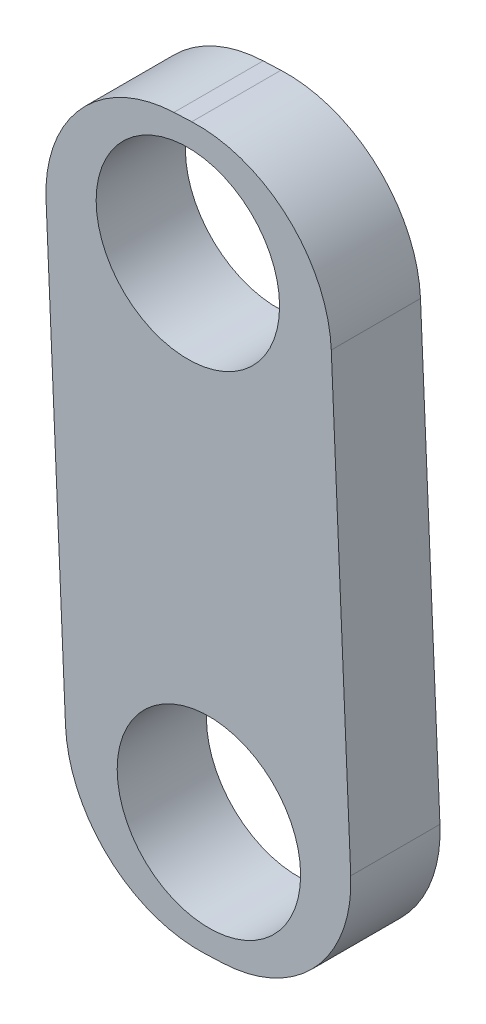
ISO-10303-21;
HEADER;
FILE_DESCRIPTION(('STEP AP214'),'2;1');
FILE_NAME('part.step','',(''),(''),'','','');
FILE_SCHEMA(('AUTOMOTIVE_DESIGN { 1 0 10303 214 1 1 1 1 }'));
ENDSEC;
DATA;
#1=APPLICATION_CONTEXT('core data for automotive mechanical design processes');
#2=APPLICATION_PROTOCOL_DEFINITION('international standard','automotive_design',2000,#1);
#3=PRODUCT_CONTEXT('',#1,'mechanical');
#4=PRODUCT('Part','Part','',(#3));
#5=PRODUCT_RELATED_PRODUCT_CATEGORY('part','',(#4));
#6=PRODUCT_DEFINITION_FORMATION('','',#4);
#7=PRODUCT_DEFINITION_CONTEXT('part definition',#1,'design');
#8=PRODUCT_DEFINITION('design','',#6,#7);
#9=PRODUCT_DEFINITION_SHAPE('','',#8);
#10=(LENGTH_UNIT() NAMED_UNIT(*) SI_UNIT(.MILLI.,.METRE.));
#11=(NAMED_UNIT(*) PLANE_ANGLE_UNIT() SI_UNIT($,.RADIAN.));
#12=(NAMED_UNIT(*) SI_UNIT($,.STERADIAN.) SOLID_ANGLE_UNIT());
#13=UNCERTAINTY_MEASURE_WITH_UNIT(LENGTH_MEASURE(1.E-05),#10,'distance_accuracy_value','');
#14=(GEOMETRIC_REPRESENTATION_CONTEXT(3) GLOBAL_UNCERTAINTY_ASSIGNED_CONTEXT((#13)) GLOBAL_UNIT_ASSIGNED_CONTEXT((#10,
#11,#12)) REPRESENTATION_CONTEXT('',''));
#15=CARTESIAN_POINT('',(0.,0.,0.));
#16=DIRECTION('',(0.,0.,1.));
#17=DIRECTION('',(1.,0.,0.));
#18=AXIS2_PLACEMENT_3D('',#15,#16,#17);
#19=CARTESIAN_POINT('',(0.,0.,3.175));
#20=DIRECTION('',(0.,0.,1.));
#21=DIRECTION('',(1.,0.,0.));
#22=AXIS2_PLACEMENT_3D('',#19,#20,#21);
#23=PLANE('',#22);
#24=CARTESIAN_POINT('',(196.85,0.,3.175));
#25=DIRECTION('',(0.,0.,1.));
#26=DIRECTION('',(1.,0.,0.));
#27=AXIS2_PLACEMENT_3D('',#24,#25,#26);
#28=CIRCLE('',#27,3.26390000000001);
#29=CARTESIAN_POINT('',(200.1139,0.,3.175));
#30=VERTEX_POINT('',#29);
#31=EDGE_CURVE('E151',#30,#30,#28,.T.);
#32=ORIENTED_EDGE('',*,*,#31,.F.);
#33=EDGE_LOOP('',(#32));
#34=FACE_BOUND('',#33,.T.);
#35=DIRECTION('',(0.999048221581858,0.0436193873653353,0.));
#36=VECTOR('',#35,1.);
#37=CARTESIAN_POINT('',(191.954264413584,-4.33119492196723,3.175));
#38=LINE('',#37,#36);
#39=CARTESIAN_POINT('',(196.712231568868,-4.12345758963982,3.175));
#40=VERTEX_POINT('',#39);
#41=CARTESIAN_POINT('',(197.346627189572,-4.09575927866283,3.175));
#42=VERTEX_POINT('',#41);
#43=EDGE_CURVE('E171',#40,#42,#38,.T.);
#44=ORIENTED_EDGE('',*,*,#43,.T.);
#45=CARTESIAN_POINT('',(197.138889857245,0.662207876620771,3.175));
#46=DIRECTION('',(0.,0.,1.));
#47=DIRECTION('',(1.,0.,0.));
#48=AXIS2_PLACEMENT_3D('',#45,#46,#47);
#49=CIRCLE('',#48,4.7625);
#50=CARTESIAN_POINT('',(201.896857012528,0.869945208948186,3.175));
#51=VERTEX_POINT('',#50);
#52=EDGE_CURVE('E224',#42,#51,#49,.T.);
#53=ORIENTED_EDGE('',*,*,#52,.T.);
#54=DIRECTION('',(-0.0436193873653369,0.999048221581858,0.));
#55=VECTOR('',#54,1.);
#56=CARTESIAN_POINT('',(200.996661905776,21.4878028818438,3.175));
#57=LINE('',#56,#55);
#58=CARTESIAN_POINT('',(201.204399238104,16.7298357265602,3.175));
#59=VERTEX_POINT('',#58);
#60=EDGE_CURVE('E159',#51,#59,#57,.T.);
#61=ORIENTED_EDGE('',*,*,#60,.T.);
#62=CARTESIAN_POINT('',(196.44643208282,16.5220983942328,3.175));
#63=DIRECTION('',(0.,0.,1.));
#64=DIRECTION('',(1.,0.,0.));
#65=AXIS2_PLACEMENT_3D('',#62,#63,#64);
#66=CIRCLE('',#65,4.7625);
#67=CARTESIAN_POINT('',(196.238694750493,21.2800655495164,3.175));
#68=VERTEX_POINT('',#67);
#69=EDGE_CURVE('E218',#59,#68,#66,.T.);
#70=ORIENTED_EDGE('',*,*,#69,.T.);
#71=DIRECTION('',(-0.999048221581858,-0.0436193873653357,0.));
#72=VECTOR('',#71,1.);
#73=CARTESIAN_POINT('',(200.996661905776,21.4878028818438,3.175));
#74=LINE('',#73,#72);
#75=CARTESIAN_POINT('',(195.604299129788,21.2523672385394,3.175));
#76=VERTEX_POINT('',#75);
#77=EDGE_CURVE('E163',#68,#76,#74,.T.);
#78=ORIENTED_EDGE('',*,*,#77,.T.);
#79=CARTESIAN_POINT('',(195.812036462115,16.4944000832558,3.175));
#80=DIRECTION('',(0.,0.,1.));
#81=DIRECTION('',(1.,0.,0.));
#82=AXIS2_PLACEMENT_3D('',#79,#80,#81);
#83=CIRCLE('',#82,4.7625);
#84=CARTESIAN_POINT('',(191.054069306832,16.2866627509284,3.175));
#85=VERTEX_POINT('',#84);
#86=EDGE_CURVE('E215',#76,#85,#83,.T.);
#87=ORIENTED_EDGE('',*,*,#86,.T.);
#88=DIRECTION('',(0.0436193873653347,-0.999048221581858,0.));
#89=VECTOR('',#88,1.);
#90=CARTESIAN_POINT('',(191.954264413584,-4.33119492196723,3.175));
#91=LINE('',#90,#89);
#92=CARTESIAN_POINT('',(191.746527081257,0.426772233316373,3.175));
#93=VERTEX_POINT('',#92);
#94=EDGE_CURVE('E168',#85,#93,#91,.T.);
#95=ORIENTED_EDGE('',*,*,#94,.T.);
#96=CARTESIAN_POINT('',(196.50449423654,0.634509565643778,3.175));
#97=DIRECTION('',(0.,0.,1.));
#98=DIRECTION('',(1.,0.,0.));
#99=AXIS2_PLACEMENT_3D('',#96,#97,#98);
#100=CIRCLE('',#99,4.7625);
#101=EDGE_CURVE('E221',#93,#40,#100,.T.);
#102=ORIENTED_EDGE('',*,*,#101,.T.);
#103=EDGE_LOOP('',(#44,#53,#61,#70,#78,#87,#95,#102));
#104=FACE_BOUND('',#103,.T.);
#105=CARTESIAN_POINT('',(196.10092631936,17.1566079598765,3.175));
#106=DIRECTION('',(0.,0.,1.));
#107=DIRECTION('',(1.,0.,0.));
#108=AXIS2_PLACEMENT_3D('',#105,#106,#107);
#109=CIRCLE('',#108,3.26389999999998);
#110=CARTESIAN_POINT('',(199.36482631936,17.1566079598765,3.175));
#111=VERTEX_POINT('',#110);
#112=EDGE_CURVE('E143',#111,#111,#109,.T.);
#113=ORIENTED_EDGE('',*,*,#112,.F.);
#114=EDGE_LOOP('',(#113));
#115=FACE_BOUND('',#114,.T.);
#116=ADVANCED_FACE('F43',(#34,#104,#115),#23,.T.);
#117=CARTESIAN_POINT('',(0.,0.,0.));
#118=DIRECTION('',(0.,0.,1.));
#119=DIRECTION('',(1.,0.,0.));
#120=AXIS2_PLACEMENT_3D('',#117,#118,#119);
#121=PLANE('',#120);
#122=DIRECTION('',(0.0436193873653347,-0.999048221581858,0.));
#123=VECTOR('',#122,1.);
#124=CARTESIAN_POINT('',(194.572276297567,8.49520904700704,0.));
#125=LINE('',#124,#123);
#126=CARTESIAN_POINT('',(194.434181118779,11.6581086453338,0.));
#127=VERTEX_POINT('',#126);
#128=CARTESIAN_POINT('',(194.710371476355,5.33230944868028,0.));
#129=VERTEX_POINT('',#128);
#130=EDGE_CURVE('E11',#127,#129,#125,.T.);
#131=ORIENTED_EDGE('',*,*,#130,.F.);
#132=DIRECTION('',(-0.999048221581858,-0.0436193873653347,0.));
#133=VECTOR('',#132,1.);
#134=CARTESIAN_POINT('',(194.434181118779,11.6581086453338,0.));
#135=LINE('',#134,#133);
#136=CARTESIAN_POINT('',(191.262203015256,11.5196170904488,0.));
#137=VERTEX_POINT('',#136);
#138=EDGE_CURVE('E127',#127,#137,#135,.T.);
#139=ORIENTED_EDGE('',*,*,#138,.T.);
#140=DIRECTION('',(0.0436193873653347,-0.999048221581858,0.));
#141=VECTOR('',#140,1.);
#142=CARTESIAN_POINT('',(191.954264413584,-4.33119492196723,0.));
#143=LINE('',#142,#141);
#144=CARTESIAN_POINT('',(191.054069306832,16.2866627509284,0.));
#145=VERTEX_POINT('',#144);
#146=EDGE_CURVE('E183',#145,#137,#143,.T.);
#147=ORIENTED_EDGE('',*,*,#146,.F.);
#148=CARTESIAN_POINT('',(195.812036462115,16.4944000832558,0.));
#149=DIRECTION('',(0.,0.,1.));
#150=DIRECTION('',(1.,0.,0.));
#151=AXIS2_PLACEMENT_3D('',#148,#149,#150);
#152=CIRCLE('',#151,4.7625);
#153=CARTESIAN_POINT('',(195.604299129788,21.2523672385394,0.));
#154=VERTEX_POINT('',#153);
#155=EDGE_CURVE('E196',#145,#154,#152,.F.);
#156=ORIENTED_EDGE('',*,*,#155,.T.);
#157=DIRECTION('',(-0.999048221581858,-0.0436193873653357,0.));
#158=VECTOR('',#157,1.);
#159=CARTESIAN_POINT('',(200.996661905776,21.4878028818438,0.));
#160=LINE('',#159,#158);
#161=CARTESIAN_POINT('',(196.238694750493,21.2800655495164,0.));
#162=VERTEX_POINT('',#161);
#163=EDGE_CURVE('E179',#162,#154,#160,.T.);
#164=ORIENTED_EDGE('',*,*,#163,.F.);
#165=CARTESIAN_POINT('',(196.44643208282,16.5220983942328,0.));
#166=DIRECTION('',(0.,0.,1.));
#167=DIRECTION('',(1.,0.,0.));
#168=AXIS2_PLACEMENT_3D('',#165,#166,#167);
#169=CIRCLE('',#168,4.7625);
#170=CARTESIAN_POINT('',(201.204399238104,16.7298357265602,0.));
#171=VERTEX_POINT('',#170);
#172=EDGE_CURVE('E199',#162,#171,#169,.F.);
#173=ORIENTED_EDGE('',*,*,#172,.T.);
#174=DIRECTION('',(-0.0436193873653369,0.999048221581858,0.));
#175=VECTOR('',#174,1.);
#176=CARTESIAN_POINT('',(200.996661905776,21.4878028818438,0.));
#177=LINE('',#176,#175);
#178=CARTESIAN_POINT('',(201.896857012528,0.869945208948186,0.));
#179=VERTEX_POINT('',#178);
#180=EDGE_CURVE('E155',#179,#171,#177,.T.);
#181=ORIENTED_EDGE('',*,*,#180,.F.);
#182=CARTESIAN_POINT('',(197.138889857245,0.662207876620771,0.));
#183=DIRECTION('',(0.,0.,1.));
#184=DIRECTION('',(1.,0.,0.));
#185=AXIS2_PLACEMENT_3D('',#182,#183,#184);
#186=CIRCLE('',#185,4.7625);
#187=CARTESIAN_POINT('',(197.346627189572,-4.09575927866283,0.));
#188=VERTEX_POINT('',#187);
#189=EDGE_CURVE('E205',#179,#188,#186,.F.);
#190=ORIENTED_EDGE('',*,*,#189,.T.);
#191=DIRECTION('',(0.999048221581858,0.0436193873653353,0.));
#192=VECTOR('',#191,1.);
#193=CARTESIAN_POINT('',(191.954264413584,-4.33119492196723,0.));
#194=LINE('',#193,#192);
#195=CARTESIAN_POINT('',(196.712231568868,-4.12345758963982,0.));
#196=VERTEX_POINT('',#195);
#197=EDGE_CURVE('E164',#196,#188,#194,.T.);
#198=ORIENTED_EDGE('',*,*,#197,.F.);
#199=CARTESIAN_POINT('',(196.50449423654,0.634509565643778,0.));
#200=DIRECTION('',(0.,0.,1.));
#201=DIRECTION('',(1.,0.,0.));
#202=AXIS2_PLACEMENT_3D('',#199,#200,#201);
#203=CIRCLE('',#202,4.7625);
#204=CARTESIAN_POINT('',(191.746527081257,0.426772233316373,0.));
#205=VERTEX_POINT('',#204);
#206=EDGE_CURVE('E202',#196,#205,#203,.F.);
#207=ORIENTED_EDGE('',*,*,#206,.T.);
#208=CARTESIAN_POINT('',(191.538393372832,5.19381789379534,0.));
#209=VERTEX_POINT('',#208);
#210=EDGE_CURVE('E135',#209,#205,#143,.T.);
#211=ORIENTED_EDGE('',*,*,#210,.F.);
#212=DIRECTION('',(-0.999048221581858,-0.0436193873653347,0.));
#213=VECTOR('',#212,1.);
#214=CARTESIAN_POINT('',(194.710371476355,5.33230944868028,0.));
#215=LINE('',#214,#213);
#216=EDGE_CURVE('E59',#209,#129,#215,.F.);
#217=ORIENTED_EDGE('',*,*,#216,.T.);
#218=EDGE_LOOP('',(#131,#139,#147,#156,#164,#173,#181,#190,#198,#207,#211,#217));
#219=FACE_BOUND('',#218,.T.);
#220=CARTESIAN_POINT('',(196.85,0.,0.));
#221=DIRECTION('',(0.,0.,1.));
#222=DIRECTION('',(1.,0.,0.));
#223=AXIS2_PLACEMENT_3D('',#220,#221,#222);
#224=CIRCLE('',#223,3.26390000000001);
#225=CARTESIAN_POINT('',(200.1139,0.,0.));
#226=VERTEX_POINT('',#225);
#227=EDGE_CURVE('E147',#226,#226,#224,.T.);
#228=ORIENTED_EDGE('',*,*,#227,.T.);
#229=EDGE_LOOP('',(#228));
#230=FACE_BOUND('',#229,.T.);
#231=CARTESIAN_POINT('',(196.10092631936,17.1566079598765,0.));
#232=DIRECTION('',(0.,0.,1.));
#233=DIRECTION('',(1.,0.,0.));
#234=AXIS2_PLACEMENT_3D('',#231,#232,#233);
#235=CIRCLE('',#234,3.26389999999998);
#236=CARTESIAN_POINT('',(199.36482631936,17.1566079598765,0.));
#237=VERTEX_POINT('',#236);
#238=EDGE_CURVE('E139',#237,#237,#235,.T.);
#239=ORIENTED_EDGE('',*,*,#238,.T.);
#240=EDGE_LOOP('',(#239));
#241=FACE_BOUND('',#240,.T.);
#242=ADVANCED_FACE('F132',(#219,#230,#241),#121,.F.);
#243=CARTESIAN_POINT('',(200.996661905776,21.4878028818438,3.175));
#244=DIRECTION('',(-0.999048221581858,-0.0436193873653369,0.));
#245=DIRECTION('',(0.0436193873653369,-0.999048221581858,0.));
#246=AXIS2_PLACEMENT_3D('',#243,#244,#245);
#247=PLANE('',#246);
#248=ORIENTED_EDGE('',*,*,#60,.F.);
#249=DIRECTION('',(0.,0.,-1.));
#250=VECTOR('',#249,1.);
#251=CARTESIAN_POINT('',(201.896857012528,0.869945208948189,3.175));
#252=LINE('',#251,#250);
#253=EDGE_CURVE('E192',#51,#179,#252,.T.);
#254=ORIENTED_EDGE('',*,*,#253,.T.);
#255=ORIENTED_EDGE('',*,*,#180,.T.);
#256=DIRECTION('',(0.,0.,-1.));
#257=VECTOR('',#256,1.);
#258=CARTESIAN_POINT('',(201.204399238104,16.7298357265602,3.175));
#259=LINE('',#258,#257);
#260=EDGE_CURVE('E175',#171,#59,#259,.F.);
#261=ORIENTED_EDGE('',*,*,#260,.T.);
#262=EDGE_LOOP('',(#248,#254,#255,#261));
#263=FACE_BOUND('',#262,.T.);
#264=ADVANCED_FACE('F268',(#263),#247,.F.);
#265=CARTESIAN_POINT('',(200.996661905776,21.4878028818438,3.175));
#266=DIRECTION('',(0.0436193873653357,-0.999048221581858,0.));
#267=DIRECTION('',(0.999048221581858,0.0436193873653357,0.));
#268=AXIS2_PLACEMENT_3D('',#265,#266,#267);
#269=PLANE('',#268);
#270=ORIENTED_EDGE('',*,*,#77,.F.);
#271=DIRECTION('',(0.,0.,-1.));
#272=VECTOR('',#271,1.);
#273=CARTESIAN_POINT('',(196.238694750493,21.2800655495164,3.175));
#274=LINE('',#273,#272);
#275=EDGE_CURVE('E52',#68,#162,#274,.T.);
#276=ORIENTED_EDGE('',*,*,#275,.T.);
#277=ORIENTED_EDGE('',*,*,#163,.T.);
#278=DIRECTION('',(0.,0.,-1.));
#279=VECTOR('',#278,1.);
#280=CARTESIAN_POINT('',(195.604299129788,21.2523672385394,3.175));
#281=LINE('',#280,#279);
#282=EDGE_CURVE('E233',#154,#76,#281,.F.);
#283=ORIENTED_EDGE('',*,*,#282,.T.);
#284=EDGE_LOOP('',(#270,#276,#277,#283));
#285=FACE_BOUND('',#284,.T.);
#286=ADVANCED_FACE('F241',(#285),#269,.F.);
#287=CARTESIAN_POINT('',(191.954264413584,-4.33119492196723,3.175));
#288=DIRECTION('',(0.999048221581858,0.0436193873653347,0.));
#289=DIRECTION('',(-0.0436193873653347,0.999048221581858,0.));
#290=AXIS2_PLACEMENT_3D('',#287,#288,#289);
#291=PLANE('',#290);
#292=ORIENTED_EDGE('',*,*,#146,.T.);
#293=CARTESIAN_POINT('',(191.400298194044,8.3567174921221,-0.793749999999998));
#294=DIRECTION('',(-0.999048221581858,-0.0436193873653347,0.));
#295=DIRECTION('',(0.0436193873653347,-0.999048221581858,0.));
#296=AXIS2_PLACEMENT_3D('',#293,#294,#295);
#297=CIRCLE('',#296,3.2639);
#298=EDGE_CURVE('E129',#209,#137,#297,.T.);
#299=ORIENTED_EDGE('',*,*,#298,.F.);
#300=ORIENTED_EDGE('',*,*,#210,.T.);
#301=DIRECTION('',(0.,0.,-1.));
#302=VECTOR('',#301,1.);
#303=CARTESIAN_POINT('',(191.746527081257,0.426772233316371,3.175));
#304=LINE('',#303,#302);
#305=EDGE_CURVE('E67',#205,#93,#304,.F.);
#306=ORIENTED_EDGE('',*,*,#305,.T.);
#307=ORIENTED_EDGE('',*,*,#94,.F.);
#308=DIRECTION('',(0.,0.,-1.));
#309=VECTOR('',#308,1.);
#310=CARTESIAN_POINT('',(191.054069306832,16.2866627509284,3.175));
#311=LINE('',#310,#309);
#312=EDGE_CURVE('E227',#85,#145,#311,.T.);
#313=ORIENTED_EDGE('',*,*,#312,.T.);
#314=EDGE_LOOP('',(#292,#299,#300,#306,#307,#313));
#315=FACE_BOUND('',#314,.T.);
#316=ADVANCED_FACE('F250',(#315),#291,.F.);
#317=CARTESIAN_POINT('',(191.954264413584,-4.33119492196723,3.175));
#318=DIRECTION('',(-0.0436193873653353,0.999048221581858,0.));
#319=DIRECTION('',(-0.999048221581858,-0.0436193873653353,0.));
#320=AXIS2_PLACEMENT_3D('',#317,#318,#319);
#321=PLANE('',#320);
#322=ORIENTED_EDGE('',*,*,#197,.T.);
#323=DIRECTION('',(0.,0.,-1.));
#324=VECTOR('',#323,1.);
#325=CARTESIAN_POINT('',(197.346627189572,-4.09575927866283,3.175));
#326=LINE('',#325,#324);
#327=EDGE_CURVE('E212',#188,#42,#326,.F.);
#328=ORIENTED_EDGE('',*,*,#327,.T.);
#329=ORIENTED_EDGE('',*,*,#43,.F.);
#330=DIRECTION('',(0.,0.,-1.));
#331=VECTOR('',#330,1.);
#332=CARTESIAN_POINT('',(196.712231568868,-4.12345758963982,3.175));
#333=LINE('',#332,#331);
#334=EDGE_CURVE('E208',#40,#196,#333,.T.);
#335=ORIENTED_EDGE('',*,*,#334,.T.);
#336=EDGE_LOOP('',(#322,#328,#329,#335));
#337=FACE_BOUND('',#336,.T.);
#338=ADVANCED_FACE('F260',(#337),#321,.F.);
#339=CARTESIAN_POINT('',(196.85,0.,3.175));
#340=DIRECTION('',(0.,0.,-1.));
#341=DIRECTION('',(-1.,0.,0.));
#342=AXIS2_PLACEMENT_3D('',#339,#340,#341);
#343=CYLINDRICAL_SURFACE('',#342,3.26390000000001);
#344=ORIENTED_EDGE('',*,*,#31,.T.);
#345=EDGE_LOOP('',(#344));
#346=FACE_BOUND('',#345,.T.);
#347=ORIENTED_EDGE('',*,*,#227,.F.);
#348=EDGE_LOOP('',(#347));
#349=FACE_BOUND('',#348,.T.);
#350=ADVANCED_FACE('F286',(#346,#349),#343,.F.);
#351=CARTESIAN_POINT('',(196.10092631936,17.1566079598765,3.175));
#352=DIRECTION('',(0.,0.,-1.));
#353=DIRECTION('',(-1.,0.,0.));
#354=AXIS2_PLACEMENT_3D('',#351,#352,#353);
#355=CYLINDRICAL_SURFACE('',#354,3.26389999999998);
#356=ORIENTED_EDGE('',*,*,#112,.T.);
#357=EDGE_LOOP('',(#356));
#358=FACE_BOUND('',#357,.T.);
#359=ORIENTED_EDGE('',*,*,#238,.F.);
#360=EDGE_LOOP('',(#359));
#361=FACE_BOUND('',#360,.T.);
#362=ADVANCED_FACE('F298',(#358,#361),#355,.F.);
#363=CARTESIAN_POINT('',(197.138889857245,0.662207876620771,3.175));
#364=DIRECTION('',(0.,0.,-1.));
#365=DIRECTION('',(-1.,0.,0.));
#366=AXIS2_PLACEMENT_3D('',#363,#364,#365);
#367=CYLINDRICAL_SURFACE('',#366,4.7625);
#368=ORIENTED_EDGE('',*,*,#52,.F.);
#369=ORIENTED_EDGE('',*,*,#327,.F.);
#370=ORIENTED_EDGE('',*,*,#189,.F.);
#371=ORIENTED_EDGE('',*,*,#253,.F.);
#372=EDGE_LOOP('',(#368,#369,#370,#371));
#373=FACE_BOUND('',#372,.T.);
#374=ADVANCED_FACE('F265',(#373),#367,.T.);
#375=CARTESIAN_POINT('',(196.50449423654,0.634509565643778,3.175));
#376=DIRECTION('',(0.,0.,-1.));
#377=DIRECTION('',(-1.,0.,0.));
#378=AXIS2_PLACEMENT_3D('',#375,#376,#377);
#379=CYLINDRICAL_SURFACE('',#378,4.7625);
#380=ORIENTED_EDGE('',*,*,#101,.F.);
#381=ORIENTED_EDGE('',*,*,#305,.F.);
#382=ORIENTED_EDGE('',*,*,#206,.F.);
#383=ORIENTED_EDGE('',*,*,#334,.F.);
#384=EDGE_LOOP('',(#380,#381,#382,#383));
#385=FACE_BOUND('',#384,.T.);
#386=ADVANCED_FACE('F257',(#385),#379,.T.);
#387=CARTESIAN_POINT('',(196.44643208282,16.5220983942328,3.175));
#388=DIRECTION('',(0.,0.,-1.));
#389=DIRECTION('',(-1.,0.,0.));
#390=AXIS2_PLACEMENT_3D('',#387,#388,#389);
#391=CYLINDRICAL_SURFACE('',#390,4.7625);
#392=ORIENTED_EDGE('',*,*,#69,.F.);
#393=ORIENTED_EDGE('',*,*,#260,.F.);
#394=ORIENTED_EDGE('',*,*,#172,.F.);
#395=ORIENTED_EDGE('',*,*,#275,.F.);
#396=EDGE_LOOP('',(#392,#393,#394,#395));
#397=FACE_BOUND('',#396,.T.);
#398=ADVANCED_FACE('F270',(#397),#391,.T.);
#399=CARTESIAN_POINT('',(195.812036462115,16.4944000832558,3.175));
#400=DIRECTION('',(0.,0.,-1.));
#401=DIRECTION('',(-1.,0.,0.));
#402=AXIS2_PLACEMENT_3D('',#399,#400,#401);
#403=CYLINDRICAL_SURFACE('',#402,4.7625);
#404=ORIENTED_EDGE('',*,*,#86,.F.);
#405=ORIENTED_EDGE('',*,*,#282,.F.);
#406=ORIENTED_EDGE('',*,*,#155,.F.);
#407=ORIENTED_EDGE('',*,*,#312,.F.);
#408=EDGE_LOOP('',(#404,#405,#406,#407));
#409=FACE_BOUND('',#408,.T.);
#410=ADVANCED_FACE('F45',(#409),#403,.T.);
#411=CARTESIAN_POINT('',(194.572276297567,8.49520904700703,-0.793749999999998));
#412=DIRECTION('',(-0.999048221581858,-0.0436193873653347,0.));
#413=DIRECTION('',(0.0436193873653347,-0.999048221581858,0.));
#414=AXIS2_PLACEMENT_3D('',#411,#412,#413);
#415=PLANE('',#414);
#416=ORIENTED_EDGE('',*,*,#130,.T.);
#417=CARTESIAN_POINT('',(194.572276297567,8.49520904700703,-0.793749999999998));
#418=DIRECTION('',(-0.999048221581858,-0.0436193873653347,0.));
#419=DIRECTION('',(0.0436193873653347,-0.999048221581858,0.));
#420=AXIS2_PLACEMENT_3D('',#417,#418,#419);
#421=CIRCLE('',#420,3.2639);
#422=EDGE_CURVE('E123',#129,#127,#421,.T.);
#423=ORIENTED_EDGE('',*,*,#422,.T.);
#424=EDGE_LOOP('',(#416,#423));
#425=FACE_BOUND('',#424,.T.);
#426=ADVANCED_FACE('F122',(#425),#415,.T.);
#427=CARTESIAN_POINT('',(194.572276297567,8.49520904700703,-0.793749999999998));
#428=DIRECTION('',(-0.999048221581858,-0.0436193873653347,0.));
#429=DIRECTION('',(0.0436193873653347,-0.999048221581858,0.));
#430=AXIS2_PLACEMENT_3D('',#427,#428,#429);
#431=CYLINDRICAL_SURFACE('',#430,3.2639);
#432=ORIENTED_EDGE('',*,*,#422,.F.);
#433=ORIENTED_EDGE('',*,*,#216,.F.);
#434=ORIENTED_EDGE('',*,*,#298,.T.);
#435=ORIENTED_EDGE('',*,*,#138,.F.);
#436=EDGE_LOOP('',(#432,#433,#434,#435));
#437=FACE_BOUND('',#436,.T.);
#438=ADVANCED_FACE('F126',(#437),#431,.F.);
#439=CLOSED_SHELL('',(#116,#242,#264,#286,#316,#338,#350,#362,#374,#386,#398,#410,#426,#438));
#440=MANIFOLD_SOLID_BREP('B2',#439);
#441=ADVANCED_BREP_SHAPE_REPRESENTATION('',(#18,#440),#14);
#442=SHAPE_DEFINITION_REPRESENTATION(#9,#441);
ENDSEC;
END-ISO-10303-21;
